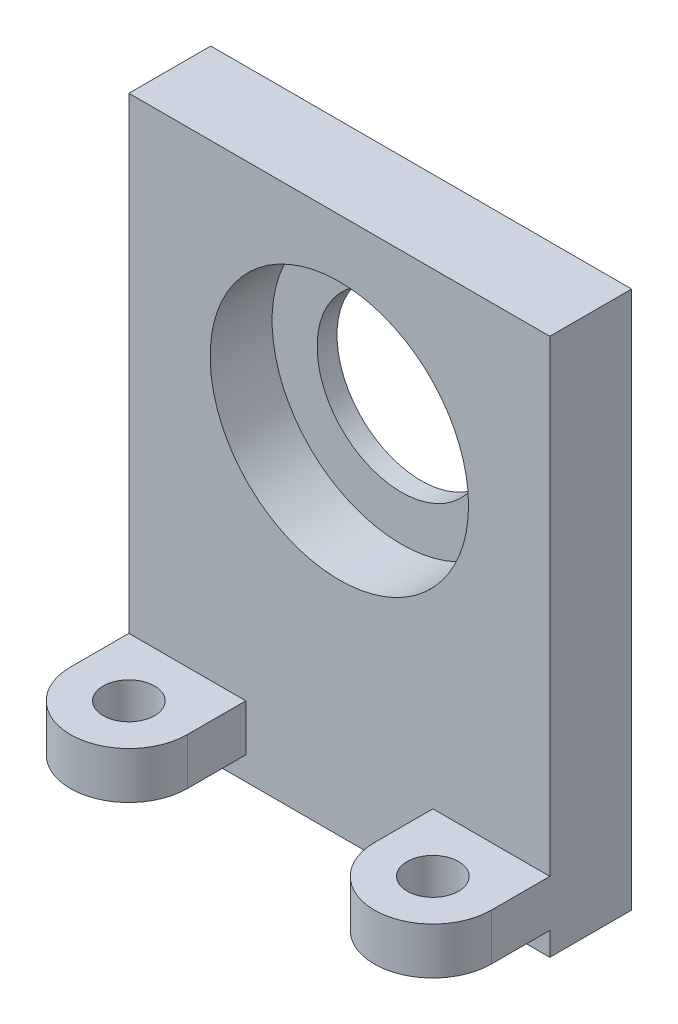
ISO-10303-21;
HEADER;
FILE_DESCRIPTION(('STEP AP214'),'2;1');
FILE_NAME('part.step','',(''),(''),'','','');
FILE_SCHEMA(('AUTOMOTIVE_DESIGN { 1 0 10303 214 1 1 1 1 }'));
ENDSEC;
DATA;
#1=APPLICATION_CONTEXT('core data for automotive mechanical design processes');
#2=APPLICATION_PROTOCOL_DEFINITION('international standard','automotive_design',2000,#1);
#3=PRODUCT_CONTEXT('',#1,'mechanical');
#4=PRODUCT('Part','Part','',(#3));
#5=PRODUCT_RELATED_PRODUCT_CATEGORY('part','',(#4));
#6=PRODUCT_DEFINITION_FORMATION('','',#4);
#7=PRODUCT_DEFINITION_CONTEXT('part definition',#1,'design');
#8=PRODUCT_DEFINITION('design','',#6,#7);
#9=PRODUCT_DEFINITION_SHAPE('','',#8);
#10=(LENGTH_UNIT() NAMED_UNIT(*) SI_UNIT(.MILLI.,.METRE.));
#11=(NAMED_UNIT(*) PLANE_ANGLE_UNIT() SI_UNIT($,.RADIAN.));
#12=(NAMED_UNIT(*) SI_UNIT($,.STERADIAN.) SOLID_ANGLE_UNIT());
#13=UNCERTAINTY_MEASURE_WITH_UNIT(LENGTH_MEASURE(1.E-05),#10,'distance_accuracy_value','');
#14=(GEOMETRIC_REPRESENTATION_CONTEXT(3) GLOBAL_UNCERTAINTY_ASSIGNED_CONTEXT((#13)) GLOBAL_UNIT_ASSIGNED_CONTEXT((#10,
#11,#12)) REPRESENTATION_CONTEXT('',''));
#15=CARTESIAN_POINT('',(0.,0.,0.));
#16=DIRECTION('',(0.,0.,1.));
#17=DIRECTION('',(1.,0.,0.));
#18=AXIS2_PLACEMENT_3D('',#15,#16,#17);
#19=CARTESIAN_POINT('',(-9.,-11.,3.5));
#20=DIRECTION('',(0.,1.,0.));
#21=DIRECTION('',(0.,0.,1.));
#22=AXIS2_PLACEMENT_3D('',#19,#20,#21);
#23=PLANE('',#22);
#24=CARTESIAN_POINT('',(6.5,-11.,6.));
#25=DIRECTION('',(0.,-1.,0.));
#26=DIRECTION('',(0.,0.,1.));
#27=AXIS2_PLACEMENT_3D('',#24,#25,#26);
#28=CIRCLE('',#27,1.1);
#29=CARTESIAN_POINT('',(6.5,-11.,7.1));
#30=VERTEX_POINT('',#29);
#31=EDGE_CURVE('E169',#30,#30,#28,.T.);
#32=ORIENTED_EDGE('',*,*,#31,.F.);
#33=EDGE_LOOP('',(#32));
#34=FACE_BOUND('',#33,.T.);
#35=DIRECTION('',(-1.,0.,0.));
#36=VECTOR('',#35,1.);
#37=CARTESIAN_POINT('',(-9.,-11.,3.5));
#38=LINE('',#37,#36);
#39=CARTESIAN_POINT('',(9.,-11.,3.5));
#40=VERTEX_POINT('',#39);
#41=CARTESIAN_POINT('',(4.,-11.,3.5));
#42=VERTEX_POINT('',#41);
#43=EDGE_CURVE('E50',#40,#42,#38,.T.);
#44=ORIENTED_EDGE('',*,*,#43,.F.);
#45=DIRECTION('',(0.,0.,-1.));
#46=VECTOR('',#45,1.);
#47=CARTESIAN_POINT('',(9.,-11.,3.5));
#48=LINE('',#47,#46);
#49=CARTESIAN_POINT('',(9.,-11.,6.));
#50=VERTEX_POINT('',#49);
#51=EDGE_CURVE('E231',#50,#40,#48,.T.);
#52=ORIENTED_EDGE('',*,*,#51,.F.);
#53=CARTESIAN_POINT('',(6.5,-11.,6.));
#54=DIRECTION('',(0.,-1.,0.));
#55=DIRECTION('',(0.,0.,1.));
#56=AXIS2_PLACEMENT_3D('',#53,#54,#55);
#57=CIRCLE('',#56,2.5);
#58=CARTESIAN_POINT('',(4.,-11.,6.));
#59=VERTEX_POINT('',#58);
#60=EDGE_CURVE('E189',#59,#50,#57,.F.);
#61=ORIENTED_EDGE('',*,*,#60,.F.);
#62=DIRECTION('',(0.,0.,1.));
#63=VECTOR('',#62,1.);
#64=CARTESIAN_POINT('',(4.,-11.,3.5));
#65=LINE('',#64,#63);
#66=EDGE_CURVE('E172',#42,#59,#65,.T.);
#67=ORIENTED_EDGE('',*,*,#66,.F.);
#68=EDGE_LOOP('',(#44,#52,#61,#67));
#69=FACE_BOUND('',#68,.T.);
#70=ADVANCED_FACE('F39',(#34,#69),#23,.F.);
#71=CARTESIAN_POINT('',(-6.5,-11.,6.));
#72=DIRECTION('',(0.,1.,0.));
#73=DIRECTION('',(0.,0.,1.));
#74=AXIS2_PLACEMENT_3D('',#71,#72,#73);
#75=CIRCLE('',#74,1.1);
#76=CARTESIAN_POINT('',(-6.5,-11.,7.1));
#77=VERTEX_POINT('',#76);
#78=EDGE_CURVE('E198',#77,#77,#75,.T.);
#79=ORIENTED_EDGE('',*,*,#78,.T.);
#80=EDGE_LOOP('',(#79));
#81=FACE_BOUND('',#80,.T.);
#82=CARTESIAN_POINT('',(-4.,-11.,3.5));
#83=VERTEX_POINT('',#82);
#84=CARTESIAN_POINT('',(-9.,-11.,3.5));
#85=VERTEX_POINT('',#84);
#86=EDGE_CURVE('E11',#83,#85,#38,.T.);
#87=ORIENTED_EDGE('',*,*,#86,.F.);
#88=DIRECTION('',(0.,0.,1.));
#89=VECTOR('',#88,1.);
#90=CARTESIAN_POINT('',(-4.,-11.,3.5));
#91=LINE('',#90,#89);
#92=CARTESIAN_POINT('',(-4.,-11.,6.));
#93=VERTEX_POINT('',#92);
#94=EDGE_CURVE('E201',#83,#93,#91,.T.);
#95=ORIENTED_EDGE('',*,*,#94,.T.);
#96=CARTESIAN_POINT('',(-6.5,-11.,6.));
#97=DIRECTION('',(0.,1.,0.));
#98=DIRECTION('',(0.,0.,1.));
#99=AXIS2_PLACEMENT_3D('',#96,#97,#98);
#100=CIRCLE('',#99,2.5);
#101=CARTESIAN_POINT('',(-9.,-11.,6.));
#102=VERTEX_POINT('',#101);
#103=EDGE_CURVE('E248',#93,#102,#100,.F.);
#104=ORIENTED_EDGE('',*,*,#103,.T.);
#105=DIRECTION('',(0.,0.,-1.));
#106=VECTOR('',#105,1.);
#107=CARTESIAN_POINT('',(-9.,-11.,3.5));
#108=LINE('',#107,#106);
#109=EDGE_CURVE('E235',#102,#85,#108,.T.);
#110=ORIENTED_EDGE('',*,*,#109,.T.);
#111=EDGE_LOOP('',(#87,#95,#104,#110));
#112=FACE_BOUND('',#111,.T.);
#113=ADVANCED_FACE('F265',(#81,#112),#23,.F.);
#114=CARTESIAN_POINT('',(-6.5,-11.,6.));
#115=DIRECTION('',(0.,-1.,0.));
#116=DIRECTION('',(0.,0.,-1.));
#117=AXIS2_PLACEMENT_3D('',#114,#115,#116);
#118=CYLINDRICAL_SURFACE('',#117,2.5);
#119=DIRECTION('',(0.,1.,0.));
#120=VECTOR('',#119,1.);
#121=CARTESIAN_POINT('',(-9.,-11.,6.));
#122=LINE('',#121,#120);
#123=CARTESIAN_POINT('',(-9.,-9.,6.));
#124=VERTEX_POINT('',#123);
#125=EDGE_CURVE('E241',#102,#124,#122,.T.);
#126=ORIENTED_EDGE('',*,*,#125,.F.);
#127=ORIENTED_EDGE('',*,*,#103,.F.);
#128=DIRECTION('',(0.,-1.,0.));
#129=VECTOR('',#128,1.);
#130=CARTESIAN_POINT('',(-4.,-9.,6.));
#131=LINE('',#130,#129);
#132=CARTESIAN_POINT('',(-4.,-9.,6.));
#133=VERTEX_POINT('',#132);
#134=EDGE_CURVE('E246',#133,#93,#131,.T.);
#135=ORIENTED_EDGE('',*,*,#134,.F.);
#136=CARTESIAN_POINT('',(-6.5,-9.,6.));
#137=DIRECTION('',(0.,1.,0.));
#138=DIRECTION('',(0.,0.,1.));
#139=AXIS2_PLACEMENT_3D('',#136,#137,#138);
#140=CIRCLE('',#139,2.5);
#141=EDGE_CURVE('E44',#124,#133,#140,.T.);
#142=ORIENTED_EDGE('',*,*,#141,.F.);
#143=EDGE_LOOP('',(#126,#127,#135,#142));
#144=FACE_BOUND('',#143,.T.);
#145=ADVANCED_FACE('F42',(#144),#118,.T.);
#146=CARTESIAN_POINT('',(0.,0.,3.5));
#147=DIRECTION('',(0.,0.,1.));
#148=DIRECTION('',(1.,0.,0.));
#149=AXIS2_PLACEMENT_3D('',#146,#147,#148);
#150=PLANE('',#149);
#151=DIRECTION('',(0.,-1.,0.));
#152=VECTOR('',#151,1.);
#153=CARTESIAN_POINT('',(4.,-9.,3.5));
#154=LINE('',#153,#152);
#155=CARTESIAN_POINT('',(4.,-9.,3.5));
#156=VERTEX_POINT('',#155);
#157=EDGE_CURVE('E179',#156,#42,#154,.T.);
#158=ORIENTED_EDGE('',*,*,#157,.F.);
#159=DIRECTION('',(-1.,0.,0.));
#160=VECTOR('',#159,1.);
#161=CARTESIAN_POINT('',(9.,-9.,3.5));
#162=LINE('',#161,#160);
#163=CARTESIAN_POINT('',(9.,-9.,3.5));
#164=VERTEX_POINT('',#163);
#165=EDGE_CURVE('E64',#164,#156,#162,.T.);
#166=ORIENTED_EDGE('',*,*,#165,.F.);
#167=DIRECTION('',(0.,1.,0.));
#168=VECTOR('',#167,1.);
#169=CARTESIAN_POINT('',(9.,11.,3.5));
#170=LINE('',#169,#168);
#171=CARTESIAN_POINT('',(9.,11.,3.5));
#172=VERTEX_POINT('',#171);
#173=EDGE_CURVE('E141',#164,#172,#170,.T.);
#174=ORIENTED_EDGE('',*,*,#173,.T.);
#175=DIRECTION('',(-1.,0.,0.));
#176=VECTOR('',#175,1.);
#177=CARTESIAN_POINT('',(-9.,11.,3.5));
#178=LINE('',#177,#176);
#179=CARTESIAN_POINT('',(-9.,11.,3.5));
#180=VERTEX_POINT('',#179);
#181=EDGE_CURVE('E226',#172,#180,#178,.T.);
#182=ORIENTED_EDGE('',*,*,#181,.T.);
#183=DIRECTION('',(0.,-1.,0.));
#184=VECTOR('',#183,1.);
#185=CARTESIAN_POINT('',(-9.,11.,3.5));
#186=LINE('',#185,#184);
#187=CARTESIAN_POINT('',(-9.,-9.,3.5));
#188=VERTEX_POINT('',#187);
#189=EDGE_CURVE('E228',#180,#188,#186,.T.);
#190=ORIENTED_EDGE('',*,*,#189,.T.);
#191=DIRECTION('',(1.,0.,0.));
#192=VECTOR('',#191,1.);
#193=CARTESIAN_POINT('',(-9.,-9.,3.5));
#194=LINE('',#193,#192);
#195=CARTESIAN_POINT('',(-4.,-9.,3.5));
#196=VERTEX_POINT('',#195);
#197=EDGE_CURVE('E204',#188,#196,#194,.T.);
#198=ORIENTED_EDGE('',*,*,#197,.T.);
#199=DIRECTION('',(0.,-1.,0.));
#200=VECTOR('',#199,1.);
#201=CARTESIAN_POINT('',(-4.,-9.,3.5));
#202=LINE('',#201,#200);
#203=EDGE_CURVE('E210',#196,#83,#202,.T.);
#204=ORIENTED_EDGE('',*,*,#203,.T.);
#205=ORIENTED_EDGE('',*,*,#86,.T.);
#206=DIRECTION('',(0.,1.,0.));
#207=VECTOR('',#206,1.);
#208=CARTESIAN_POINT('',(-9.,-12.,3.5));
#209=LINE('',#208,#207);
#210=CARTESIAN_POINT('',(-9.,-12.,3.5));
#211=VERTEX_POINT('',#210);
#212=EDGE_CURVE('E160',#211,#85,#209,.T.);
#213=ORIENTED_EDGE('',*,*,#212,.F.);
#214=DIRECTION('',(-1.,0.,0.));
#215=VECTOR('',#214,1.);
#216=CARTESIAN_POINT('',(-9.,-12.,3.5));
#217=LINE('',#216,#215);
#218=CARTESIAN_POINT('',(9.,-12.,3.5));
#219=VERTEX_POINT('',#218);
#220=EDGE_CURVE('E155',#219,#211,#217,.T.);
#221=ORIENTED_EDGE('',*,*,#220,.F.);
#222=DIRECTION('',(0.,1.,0.));
#223=VECTOR('',#222,1.);
#224=CARTESIAN_POINT('',(9.,-12.,3.5));
#225=LINE('',#224,#223);
#226=EDGE_CURVE('E163',#219,#40,#225,.T.);
#227=ORIENTED_EDGE('',*,*,#226,.T.);
#228=ORIENTED_EDGE('',*,*,#43,.T.);
#229=EDGE_LOOP('',(#158,#166,#174,#182,#190,#198,#204,#205,#213,#221,#227,#228));
#230=FACE_BOUND('',#229,.T.);
#231=CARTESIAN_POINT('',(0.,3.,3.5));
#232=DIRECTION('',(0.,0.,1.));
#233=DIRECTION('',(1.,0.,0.));
#234=AXIS2_PLACEMENT_3D('',#231,#232,#233);
#235=CIRCLE('',#234,5.525);
#236=CARTESIAN_POINT('',(5.525,3.,3.5));
#237=VERTEX_POINT('',#236);
#238=EDGE_CURVE('E215',#237,#237,#235,.T.);
#239=ORIENTED_EDGE('',*,*,#238,.F.);
#240=EDGE_LOOP('',(#239));
#241=FACE_BOUND('',#240,.T.);
#242=ADVANCED_FACE('F261',(#230,#241),#150,.T.);
#243=CARTESIAN_POINT('',(0.,3.,0.));
#244=DIRECTION('',(0.,0.,1.));
#245=DIRECTION('',(1.,0.,0.));
#246=AXIS2_PLACEMENT_3D('',#243,#244,#245);
#247=CYLINDRICAL_SURFACE('',#246,3.6);
#248=CARTESIAN_POINT('',(0.,3.,0.));
#249=DIRECTION('',(0.,0.,1.));
#250=DIRECTION('',(1.,0.,0.));
#251=AXIS2_PLACEMENT_3D('',#248,#249,#250);
#252=CIRCLE('',#251,3.6);
#253=CARTESIAN_POINT('',(3.6,3.,0.));
#254=VERTEX_POINT('',#253);
#255=EDGE_CURVE('E222',#254,#254,#252,.T.);
#256=ORIENTED_EDGE('',*,*,#255,.F.);
#257=EDGE_LOOP('',(#256));
#258=FACE_BOUND('',#257,.T.);
#259=CARTESIAN_POINT('',(0.,3.,0.85));
#260=DIRECTION('',(0.,0.,1.));
#261=DIRECTION('',(1.,0.,0.));
#262=AXIS2_PLACEMENT_3D('',#259,#260,#261);
#263=CIRCLE('',#262,3.6);
#264=CARTESIAN_POINT('',(3.6,3.,0.85));
#265=VERTEX_POINT('',#264);
#266=EDGE_CURVE('E219',#265,#265,#263,.F.);
#267=ORIENTED_EDGE('',*,*,#266,.F.);
#268=EDGE_LOOP('',(#267));
#269=FACE_BOUND('',#268,.T.);
#270=ADVANCED_FACE('F284',(#258,#269),#247,.F.);
#271=CARTESIAN_POINT('',(9.,11.,3.5));
#272=DIRECTION('',(-1.,0.,0.));
#273=DIRECTION('',(0.,-1.,0.));
#274=AXIS2_PLACEMENT_3D('',#271,#272,#273);
#275=PLANE('',#274);
#276=DIRECTION('',(0.,1.,0.));
#277=VECTOR('',#276,1.);
#278=CARTESIAN_POINT('',(9.,11.,0.));
#279=LINE('',#278,#277);
#280=CARTESIAN_POINT('',(9.,-12.,0.));
#281=VERTEX_POINT('',#280);
#282=CARTESIAN_POINT('',(9.,11.,0.));
#283=VERTEX_POINT('',#282);
#284=EDGE_CURVE('E148',#281,#283,#279,.T.);
#285=ORIENTED_EDGE('',*,*,#284,.T.);
#286=DIRECTION('',(0.,0.,-1.));
#287=VECTOR('',#286,1.);
#288=CARTESIAN_POINT('',(9.,11.,3.5));
#289=LINE('',#288,#287);
#290=EDGE_CURVE('E238',#172,#283,#289,.T.);
#291=ORIENTED_EDGE('',*,*,#290,.F.);
#292=ORIENTED_EDGE('',*,*,#173,.F.);
#293=DIRECTION('',(0.,0.,-1.));
#294=VECTOR('',#293,1.);
#295=CARTESIAN_POINT('',(9.,-9.,3.5));
#296=LINE('',#295,#294);
#297=CARTESIAN_POINT('',(9.,-9.,6.));
#298=VERTEX_POINT('',#297);
#299=EDGE_CURVE('E173',#298,#164,#296,.T.);
#300=ORIENTED_EDGE('',*,*,#299,.F.);
#301=DIRECTION('',(0.,1.,0.));
#302=VECTOR('',#301,1.);
#303=CARTESIAN_POINT('',(9.,-11.,6.));
#304=LINE('',#303,#302);
#305=EDGE_CURVE('E183',#50,#298,#304,.T.);
#306=ORIENTED_EDGE('',*,*,#305,.F.);
#307=ORIENTED_EDGE('',*,*,#51,.T.);
#308=ORIENTED_EDGE('',*,*,#226,.F.);
#309=DIRECTION('',(0.,0.,1.));
#310=VECTOR('',#309,1.);
#311=CARTESIAN_POINT('',(9.,-12.,0.));
#312=LINE('',#311,#310);
#313=EDGE_CURVE('E151',#281,#219,#312,.T.);
#314=ORIENTED_EDGE('',*,*,#313,.F.);
#315=EDGE_LOOP('',(#285,#291,#292,#300,#306,#307,#308,#314));
#316=FACE_BOUND('',#315,.T.);
#317=ADVANCED_FACE('F281',(#316),#275,.F.);
#318=CARTESIAN_POINT('',(-9.,11.,3.5));
#319=DIRECTION('',(0.,-1.,0.));
#320=DIRECTION('',(0.,0.,-1.));
#321=AXIS2_PLACEMENT_3D('',#318,#319,#320);
#322=PLANE('',#321);
#323=DIRECTION('',(-1.,0.,0.));
#324=VECTOR('',#323,1.);
#325=CARTESIAN_POINT('',(-9.,11.,0.));
#326=LINE('',#325,#324);
#327=CARTESIAN_POINT('',(-9.,11.,0.));
#328=VERTEX_POINT('',#327);
#329=EDGE_CURVE('E142',#283,#328,#326,.T.);
#330=ORIENTED_EDGE('',*,*,#329,.T.);
#331=DIRECTION('',(0.,0.,-1.));
#332=VECTOR('',#331,1.);
#333=CARTESIAN_POINT('',(-9.,11.,3.5));
#334=LINE('',#333,#332);
#335=EDGE_CURVE('E139',#180,#328,#334,.T.);
#336=ORIENTED_EDGE('',*,*,#335,.F.);
#337=ORIENTED_EDGE('',*,*,#181,.F.);
#338=ORIENTED_EDGE('',*,*,#290,.T.);
#339=EDGE_LOOP('',(#330,#336,#337,#338));
#340=FACE_BOUND('',#339,.T.);
#341=ADVANCED_FACE('F279',(#340),#322,.F.);
#342=CARTESIAN_POINT('',(-9.,11.,3.5));
#343=DIRECTION('',(1.,0.,0.));
#344=DIRECTION('',(0.,1.,0.));
#345=AXIS2_PLACEMENT_3D('',#342,#343,#344);
#346=PLANE('',#345);
#347=DIRECTION('',(0.,0.,-1.));
#348=VECTOR('',#347,1.);
#349=CARTESIAN_POINT('',(-9.,-9.,3.5));
#350=LINE('',#349,#348);
#351=EDGE_CURVE('E202',#124,#188,#350,.T.);
#352=ORIENTED_EDGE('',*,*,#351,.T.);
#353=ORIENTED_EDGE('',*,*,#189,.F.);
#354=ORIENTED_EDGE('',*,*,#335,.T.);
#355=DIRECTION('',(0.,-1.,0.));
#356=VECTOR('',#355,1.);
#357=CARTESIAN_POINT('',(-9.,11.,0.));
#358=LINE('',#357,#356);
#359=CARTESIAN_POINT('',(-9.,-12.,0.));
#360=VERTEX_POINT('',#359);
#361=EDGE_CURVE('E131',#328,#360,#358,.T.);
#362=ORIENTED_EDGE('',*,*,#361,.T.);
#363=DIRECTION('',(0.,0.,-1.));
#364=VECTOR('',#363,1.);
#365=CARTESIAN_POINT('',(-9.,-12.,0.));
#366=LINE('',#365,#364);
#367=EDGE_CURVE('E136',#211,#360,#366,.T.);
#368=ORIENTED_EDGE('',*,*,#367,.F.);
#369=ORIENTED_EDGE('',*,*,#212,.T.);
#370=ORIENTED_EDGE('',*,*,#109,.F.);
#371=ORIENTED_EDGE('',*,*,#125,.T.);
#372=EDGE_LOOP('',(#352,#353,#354,#362,#368,#369,#370,#371));
#373=FACE_BOUND('',#372,.T.);
#374=ADVANCED_FACE('F133',(#373),#346,.F.);
#375=CARTESIAN_POINT('',(0.,0.,0.));
#376=DIRECTION('',(0.,0.,1.));
#377=DIRECTION('',(1.,0.,0.));
#378=AXIS2_PLACEMENT_3D('',#375,#376,#377);
#379=PLANE('',#378);
#380=ORIENTED_EDGE('',*,*,#255,.T.);
#381=EDGE_LOOP('',(#380));
#382=FACE_BOUND('',#381,.T.);
#383=ORIENTED_EDGE('',*,*,#284,.F.);
#384=DIRECTION('',(1.,0.,0.));
#385=VECTOR('',#384,1.);
#386=CARTESIAN_POINT('',(-9.,-12.,0.));
#387=LINE('',#386,#385);
#388=EDGE_CURVE('E145',#360,#281,#387,.T.);
#389=ORIENTED_EDGE('',*,*,#388,.F.);
#390=ORIENTED_EDGE('',*,*,#361,.F.);
#391=ORIENTED_EDGE('',*,*,#329,.F.);
#392=EDGE_LOOP('',(#383,#389,#390,#391));
#393=FACE_BOUND('',#392,.T.);
#394=ADVANCED_FACE('F146',(#382,#393),#379,.F.);
#395=CARTESIAN_POINT('',(0.,3.,0.85));
#396=DIRECTION('',(0.,0.,1.));
#397=DIRECTION('',(1.,0.,0.));
#398=AXIS2_PLACEMENT_3D('',#395,#396,#397);
#399=PLANE('',#398);
#400=CARTESIAN_POINT('',(0.,3.,0.85));
#401=DIRECTION('',(0.,0.,1.));
#402=DIRECTION('',(1.,0.,0.));
#403=AXIS2_PLACEMENT_3D('',#400,#401,#402);
#404=CIRCLE('',#403,5.525);
#405=CARTESIAN_POINT('',(5.525,3.,0.85));
#406=VERTEX_POINT('',#405);
#407=EDGE_CURVE('E216',#406,#406,#404,.T.);
#408=ORIENTED_EDGE('',*,*,#407,.T.);
#409=EDGE_LOOP('',(#408));
#410=FACE_BOUND('',#409,.T.);
#411=ORIENTED_EDGE('',*,*,#266,.T.);
#412=EDGE_LOOP('',(#411));
#413=FACE_BOUND('',#412,.T.);
#414=ADVANCED_FACE('F322',(#410,#413),#399,.T.);
#415=CARTESIAN_POINT('',(0.,3.,0.85));
#416=DIRECTION('',(0.,0.,1.));
#417=DIRECTION('',(1.,0.,0.));
#418=AXIS2_PLACEMENT_3D('',#415,#416,#417);
#419=CYLINDRICAL_SURFACE('',#418,5.525);
#420=ORIENTED_EDGE('',*,*,#407,.F.);
#421=EDGE_LOOP('',(#420));
#422=FACE_BOUND('',#421,.T.);
#423=ORIENTED_EDGE('',*,*,#238,.T.);
#424=EDGE_LOOP('',(#423));
#425=FACE_BOUND('',#424,.T.);
#426=ADVANCED_FACE('F321',(#422,#425),#419,.F.);
#427=CARTESIAN_POINT('',(-4.,-9.,3.5));
#428=DIRECTION('',(1.,0.,0.));
#429=DIRECTION('',(0.,0.,-1.));
#430=AXIS2_PLACEMENT_3D('',#427,#428,#429);
#431=PLANE('',#430);
#432=DIRECTION('',(0.,0.,1.));
#433=VECTOR('',#432,1.);
#434=CARTESIAN_POINT('',(-4.,-9.,3.5));
#435=LINE('',#434,#433);
#436=EDGE_CURVE('E207',#196,#133,#435,.T.);
#437=ORIENTED_EDGE('',*,*,#436,.T.);
#438=ORIENTED_EDGE('',*,*,#134,.T.);
#439=ORIENTED_EDGE('',*,*,#94,.F.);
#440=ORIENTED_EDGE('',*,*,#203,.F.);
#441=EDGE_LOOP('',(#437,#438,#439,#440));
#442=FACE_BOUND('',#441,.T.);
#443=ADVANCED_FACE('F260',(#442),#431,.T.);
#444=CARTESIAN_POINT('',(0.,-9.,0.));
#445=DIRECTION('',(0.,1.,0.));
#446=DIRECTION('',(0.,0.,1.));
#447=AXIS2_PLACEMENT_3D('',#444,#445,#446);
#448=PLANE('',#447);
#449=CARTESIAN_POINT('',(-6.5,-9.,6.));
#450=DIRECTION('',(0.,1.,0.));
#451=DIRECTION('',(0.,0.,1.));
#452=AXIS2_PLACEMENT_3D('',#449,#450,#451);
#453=CIRCLE('',#452,1.1);
#454=CARTESIAN_POINT('',(-6.5,-9.,7.1));
#455=VERTEX_POINT('',#454);
#456=EDGE_CURVE('E195',#455,#455,#453,.T.);
#457=ORIENTED_EDGE('',*,*,#456,.F.);
#458=EDGE_LOOP('',(#457));
#459=FACE_BOUND('',#458,.T.);
#460=ORIENTED_EDGE('',*,*,#351,.F.);
#461=ORIENTED_EDGE('',*,*,#141,.T.);
#462=ORIENTED_EDGE('',*,*,#436,.F.);
#463=ORIENTED_EDGE('',*,*,#197,.F.);
#464=EDGE_LOOP('',(#460,#461,#462,#463));
#465=FACE_BOUND('',#464,.T.);
#466=ADVANCED_FACE('F255',(#459,#465),#448,.T.);
#467=CARTESIAN_POINT('',(-6.5,-12.,6.));
#468=DIRECTION('',(0.,1.,0.));
#469=DIRECTION('',(0.,0.,1.));
#470=AXIS2_PLACEMENT_3D('',#467,#468,#469);
#471=CYLINDRICAL_SURFACE('',#470,1.1);
#472=ORIENTED_EDGE('',*,*,#456,.T.);
#473=EDGE_LOOP('',(#472));
#474=FACE_BOUND('',#473,.T.);
#475=ORIENTED_EDGE('',*,*,#78,.F.);
#476=EDGE_LOOP('',(#475));
#477=FACE_BOUND('',#476,.T.);
#478=ADVANCED_FACE('F305',(#474,#477),#471,.F.);
#479=CARTESIAN_POINT('',(6.5,-11.,6.));
#480=DIRECTION('',(0.,-1.,0.));
#481=DIRECTION('',(0.,0.,-1.));
#482=AXIS2_PLACEMENT_3D('',#479,#480,#481);
#483=CYLINDRICAL_SURFACE('',#482,2.5);
#484=ORIENTED_EDGE('',*,*,#305,.T.);
#485=CARTESIAN_POINT('',(6.5,-9.,6.));
#486=DIRECTION('',(0.,-1.,0.));
#487=DIRECTION('',(0.,0.,1.));
#488=AXIS2_PLACEMENT_3D('',#485,#486,#487);
#489=CIRCLE('',#488,2.5);
#490=CARTESIAN_POINT('',(4.,-9.,6.));
#491=VERTEX_POINT('',#490);
#492=EDGE_CURVE('E192',#298,#491,#489,.T.);
#493=ORIENTED_EDGE('',*,*,#492,.T.);
#494=DIRECTION('',(0.,-1.,0.));
#495=VECTOR('',#494,1.);
#496=CARTESIAN_POINT('',(4.,-9.,6.));
#497=LINE('',#496,#495);
#498=EDGE_CURVE('E186',#491,#59,#497,.T.);
#499=ORIENTED_EDGE('',*,*,#498,.T.);
#500=ORIENTED_EDGE('',*,*,#60,.T.);
#501=EDGE_LOOP('',(#484,#493,#499,#500));
#502=FACE_BOUND('',#501,.T.);
#503=ADVANCED_FACE('F302',(#502),#483,.T.);
#504=CARTESIAN_POINT('',(4.,-9.,3.5));
#505=DIRECTION('',(-1.,0.,0.));
#506=DIRECTION('',(0.,0.,-1.));
#507=AXIS2_PLACEMENT_3D('',#504,#505,#506);
#508=PLANE('',#507);
#509=DIRECTION('',(0.,0.,1.));
#510=VECTOR('',#509,1.);
#511=CARTESIAN_POINT('',(4.,-9.,3.5));
#512=LINE('',#511,#510);
#513=EDGE_CURVE('E177',#156,#491,#512,.T.);
#514=ORIENTED_EDGE('',*,*,#513,.F.);
#515=ORIENTED_EDGE('',*,*,#157,.T.);
#516=ORIENTED_EDGE('',*,*,#66,.T.);
#517=ORIENTED_EDGE('',*,*,#498,.F.);
#518=EDGE_LOOP('',(#514,#515,#516,#517));
#519=FACE_BOUND('',#518,.T.);
#520=ADVANCED_FACE('F297',(#519),#508,.T.);
#521=CARTESIAN_POINT('',(0.,-9.,0.));
#522=DIRECTION('',(0.,1.,0.));
#523=DIRECTION('',(0.,0.,1.));
#524=AXIS2_PLACEMENT_3D('',#521,#522,#523);
#525=PLANE('',#524);
#526=CARTESIAN_POINT('',(6.5,-9.,6.));
#527=DIRECTION('',(0.,-1.,0.));
#528=DIRECTION('',(0.,0.,1.));
#529=AXIS2_PLACEMENT_3D('',#526,#527,#528);
#530=CIRCLE('',#529,1.1);
#531=CARTESIAN_POINT('',(6.5,-9.,7.1));
#532=VERTEX_POINT('',#531);
#533=EDGE_CURVE('E166',#532,#532,#530,.T.);
#534=ORIENTED_EDGE('',*,*,#533,.T.);
#535=EDGE_LOOP('',(#534));
#536=FACE_BOUND('',#535,.T.);
#537=ORIENTED_EDGE('',*,*,#299,.T.);
#538=ORIENTED_EDGE('',*,*,#165,.T.);
#539=ORIENTED_EDGE('',*,*,#513,.T.);
#540=ORIENTED_EDGE('',*,*,#492,.F.);
#541=EDGE_LOOP('',(#537,#538,#539,#540));
#542=FACE_BOUND('',#541,.T.);
#543=ADVANCED_FACE('F300',(#536,#542),#525,.T.);
#544=CARTESIAN_POINT('',(6.5,-12.,6.));
#545=DIRECTION('',(0.,1.,0.));
#546=DIRECTION('',(0.,0.,1.));
#547=AXIS2_PLACEMENT_3D('',#544,#545,#546);
#548=CYLINDRICAL_SURFACE('',#547,1.1);
#549=ORIENTED_EDGE('',*,*,#533,.F.);
#550=EDGE_LOOP('',(#549));
#551=FACE_BOUND('',#550,.T.);
#552=ORIENTED_EDGE('',*,*,#31,.T.);
#553=EDGE_LOOP('',(#552));
#554=FACE_BOUND('',#553,.T.);
#555=ADVANCED_FACE('F425',(#551,#554),#548,.F.);
#556=CARTESIAN_POINT('',(0.,-12.,0.));
#557=DIRECTION('',(0.,1.,0.));
#558=DIRECTION('',(0.,0.,1.));
#559=AXIS2_PLACEMENT_3D('',#556,#557,#558);
#560=PLANE('',#559);
#561=ORIENTED_EDGE('',*,*,#367,.T.);
#562=ORIENTED_EDGE('',*,*,#388,.T.);
#563=ORIENTED_EDGE('',*,*,#313,.T.);
#564=ORIENTED_EDGE('',*,*,#220,.T.);
#565=EDGE_LOOP('',(#561,#562,#563,#564));
#566=FACE_BOUND('',#565,.T.);
#567=ADVANCED_FACE('F153',(#566),#560,.F.);
#568=CLOSED_SHELL('',(#70,#113,#145,#242,#270,#317,#341,#374,#394,#414,#426,#443,#466,#478,#503,
#520,#543,#555,#567));
#569=MANIFOLD_SOLID_BREP('B2',#568);
#570=ADVANCED_BREP_SHAPE_REPRESENTATION('',(#18,#569),#14);
#571=SHAPE_DEFINITION_REPRESENTATION(#9,#570);
ENDSEC;
END-ISO-10303-21;
